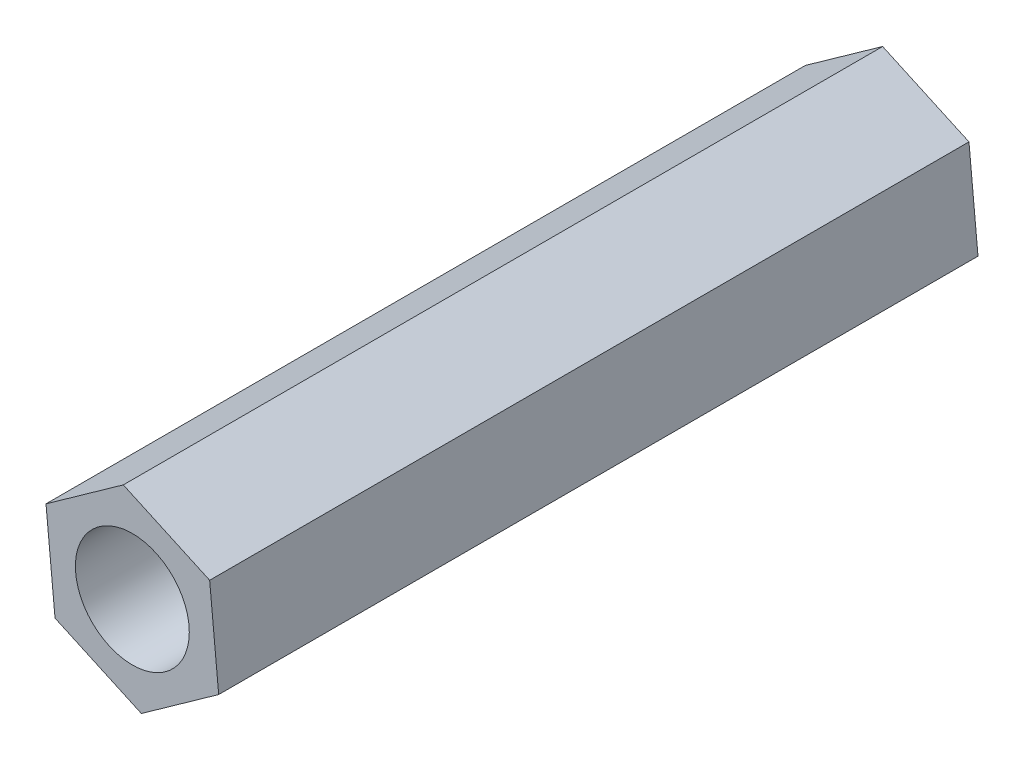
ISO-10303-21;
HEADER;
FILE_DESCRIPTION(('STEP AP214'),'2;1');
FILE_NAME('part.step','',(''),(''),'','','');
FILE_SCHEMA(('AUTOMOTIVE_DESIGN { 1 0 10303 214 1 1 1 1 }'));
ENDSEC;
DATA;
#1=APPLICATION_CONTEXT('core data for automotive mechanical design processes');
#2=APPLICATION_PROTOCOL_DEFINITION('international standard','automotive_design',2000,#1);
#3=PRODUCT_CONTEXT('',#1,'mechanical');
#4=PRODUCT('Part','Part','',(#3));
#5=PRODUCT_RELATED_PRODUCT_CATEGORY('part','',(#4));
#6=PRODUCT_DEFINITION_FORMATION('','',#4);
#7=PRODUCT_DEFINITION_CONTEXT('part definition',#1,'design');
#8=PRODUCT_DEFINITION('design','',#6,#7);
#9=PRODUCT_DEFINITION_SHAPE('','',#8);
#10=(LENGTH_UNIT() NAMED_UNIT(*) SI_UNIT(.MILLI.,.METRE.));
#11=(NAMED_UNIT(*) PLANE_ANGLE_UNIT() SI_UNIT($,.RADIAN.));
#12=(NAMED_UNIT(*) SI_UNIT($,.STERADIAN.) SOLID_ANGLE_UNIT());
#13=UNCERTAINTY_MEASURE_WITH_UNIT(LENGTH_MEASURE(1.E-05),#10,'distance_accuracy_value','');
#14=(GEOMETRIC_REPRESENTATION_CONTEXT(3) GLOBAL_UNCERTAINTY_ASSIGNED_CONTEXT((#13)) GLOBAL_UNIT_ASSIGNED_CONTEXT((#10,
#11,#12)) REPRESENTATION_CONTEXT('',''));
#15=CARTESIAN_POINT('',(0.,0.,0.));
#16=DIRECTION('',(0.,0.,1.));
#17=DIRECTION('',(1.,0.,0.));
#18=AXIS2_PLACEMENT_3D('',#15,#16,#17);
#19=CARTESIAN_POINT('',(0.,0.,20.));
#20=DIRECTION('',(0.,0.,1.));
#21=DIRECTION('',(1.,0.,0.));
#22=AXIS2_PLACEMENT_3D('',#19,#20,#21);
#23=PLANE('',#22);
#24=DIRECTION('',(-0.0950721836324173,0.995470381226566,0.));
#25=VECTOR('',#24,1.);
#26=CARTESIAN_POINT('',(2.27409682668349,-1.03850066098588,20.));
#27=LINE('',#26,#25);
#28=CARTESIAN_POINT('',(2.27409682668349,-1.03850066098588,20.));
#29=VERTEX_POINT('',#28);
#30=CARTESIAN_POINT('',(2.03641636760244,1.45017529208054,20.));
#31=VERTEX_POINT('',#30);
#32=EDGE_CURVE('E146',#29,#31,#27,.T.);
#33=ORIENTED_EDGE('',*,*,#32,.T.);
#34=DIRECTION('',(-0.909638730673394,0.41540026439435,0.));
#35=VECTOR('',#34,1.);
#36=CARTESIAN_POINT('',(2.03641636760244,1.45017529208054,20.));
#37=LINE('',#36,#35);
#38=CARTESIAN_POINT('',(-0.237680459081043,2.48867595306641,20.));
#39=VERTEX_POINT('',#38);
#40=EDGE_CURVE('E94',#31,#39,#37,.T.);
#41=ORIENTED_EDGE('',*,*,#40,.T.);
#42=DIRECTION('',(-0.814566547040977,-0.580070116832216,0.));
#43=VECTOR('',#42,1.);
#44=CARTESIAN_POINT('',(-0.237680459081043,2.48867595306641,20.));
#45=LINE('',#44,#43);
#46=CARTESIAN_POINT('',(-2.27409682668349,1.03850066098588,20.));
#47=VERTEX_POINT('',#46);
#48=EDGE_CURVE('E107',#39,#47,#45,.T.);
#49=ORIENTED_EDGE('',*,*,#48,.T.);
#50=DIRECTION('',(0.0950721836324175,-0.995470381226566,0.));
#51=VECTOR('',#50,1.);
#52=CARTESIAN_POINT('',(-2.27409682668349,1.03850066098588,20.));
#53=LINE('',#52,#51);
#54=CARTESIAN_POINT('',(-2.03641636760244,-1.45017529208054,20.));
#55=VERTEX_POINT('',#54);
#56=EDGE_CURVE('E101',#47,#55,#53,.T.);
#57=ORIENTED_EDGE('',*,*,#56,.T.);
#58=DIRECTION('',(0.909638730673394,-0.41540026439435,0.));
#59=VECTOR('',#58,1.);
#60=CARTESIAN_POINT('',(-2.03641636760244,-1.45017529208054,20.));
#61=LINE('',#60,#59);
#62=CARTESIAN_POINT('',(0.237680459081043,-2.48867595306641,20.));
#63=VERTEX_POINT('',#62);
#64=EDGE_CURVE('E105',#55,#63,#61,.T.);
#65=ORIENTED_EDGE('',*,*,#64,.T.);
#66=DIRECTION('',(0.814566547040977,0.580070116832215,0.));
#67=VECTOR('',#66,1.);
#68=CARTESIAN_POINT('',(0.237680459081043,-2.48867595306641,20.));
#69=LINE('',#68,#67);
#70=EDGE_CURVE('E57',#63,#29,#69,.T.);
#71=ORIENTED_EDGE('',*,*,#70,.T.);
#72=EDGE_LOOP('',(#33,#41,#49,#57,#65,#71));
#73=FACE_BOUND('',#72,.T.);
#74=CARTESIAN_POINT('',(0.,0.,20.));
#75=DIRECTION('',(0.,0.,1.));
#76=DIRECTION('',(1.,0.,0.));
#77=AXIS2_PLACEMENT_3D('',#74,#75,#76);
#78=CIRCLE('',#77,1.5);
#79=CARTESIAN_POINT('',(1.5,0.,20.));
#80=VERTEX_POINT('',#79);
#81=EDGE_CURVE('E134',#80,#80,#78,.T.);
#82=ORIENTED_EDGE('',*,*,#81,.F.);
#83=EDGE_LOOP('',(#82));
#84=FACE_BOUND('',#83,.T.);
#85=ADVANCED_FACE('F39',(#73,#84),#23,.T.);
#86=CARTESIAN_POINT('',(0.,0.,0.));
#87=DIRECTION('',(0.,0.,1.));
#88=DIRECTION('',(1.,0.,0.));
#89=AXIS2_PLACEMENT_3D('',#86,#87,#88);
#90=PLANE('',#89);
#91=DIRECTION('',(-0.0950721836324173,0.995470381226566,0.));
#92=VECTOR('',#91,1.);
#93=CARTESIAN_POINT('',(2.27409682668349,-1.03850066098588,0.));
#94=LINE('',#93,#92);
#95=CARTESIAN_POINT('',(2.27409682668349,-1.03850066098588,0.));
#96=VERTEX_POINT('',#95);
#97=CARTESIAN_POINT('',(2.03641636760244,1.45017529208054,0.));
#98=VERTEX_POINT('',#97);
#99=EDGE_CURVE('E129',#96,#98,#94,.T.);
#100=ORIENTED_EDGE('',*,*,#99,.F.);
#101=DIRECTION('',(0.814566547040977,0.580070116832215,0.));
#102=VECTOR('',#101,1.);
#103=CARTESIAN_POINT('',(0.237680459081043,-2.48867595306641,0.));
#104=LINE('',#103,#102);
#105=CARTESIAN_POINT('',(0.237680459081043,-2.48867595306641,0.));
#106=VERTEX_POINT('',#105);
#107=EDGE_CURVE('E86',#106,#96,#104,.T.);
#108=ORIENTED_EDGE('',*,*,#107,.F.);
#109=DIRECTION('',(0.909638730673394,-0.41540026439435,0.));
#110=VECTOR('',#109,1.);
#111=CARTESIAN_POINT('',(-2.03641636760244,-1.45017529208054,0.));
#112=LINE('',#111,#110);
#113=CARTESIAN_POINT('',(-2.03641636760244,-1.45017529208054,0.));
#114=VERTEX_POINT('',#113);
#115=EDGE_CURVE('E80',#114,#106,#112,.T.);
#116=ORIENTED_EDGE('',*,*,#115,.F.);
#117=DIRECTION('',(0.0950721836324175,-0.995470381226566,0.));
#118=VECTOR('',#117,1.);
#119=CARTESIAN_POINT('',(-2.27409682668349,1.03850066098588,0.));
#120=LINE('',#119,#118);
#121=CARTESIAN_POINT('',(-2.27409682668349,1.03850066098588,0.));
#122=VERTEX_POINT('',#121);
#123=EDGE_CURVE('E116',#122,#114,#120,.T.);
#124=ORIENTED_EDGE('',*,*,#123,.F.);
#125=DIRECTION('',(-0.814566547040977,-0.580070116832216,0.));
#126=VECTOR('',#125,1.);
#127=CARTESIAN_POINT('',(-0.237680459081043,2.48867595306641,0.));
#128=LINE('',#127,#126);
#129=CARTESIAN_POINT('',(-0.237680459081043,2.48867595306641,0.));
#130=VERTEX_POINT('',#129);
#131=EDGE_CURVE('E137',#130,#122,#128,.T.);
#132=ORIENTED_EDGE('',*,*,#131,.F.);
#133=DIRECTION('',(-0.909638730673394,0.41540026439435,0.));
#134=VECTOR('',#133,1.);
#135=CARTESIAN_POINT('',(2.03641636760244,1.45017529208054,0.));
#136=LINE('',#135,#134);
#137=EDGE_CURVE('E133',#98,#130,#136,.T.);
#138=ORIENTED_EDGE('',*,*,#137,.F.);
#139=EDGE_LOOP('',(#100,#108,#116,#124,#132,#138));
#140=FACE_BOUND('',#139,.T.);
#141=CARTESIAN_POINT('',(0.,0.,0.));
#142=DIRECTION('',(0.,0.,1.));
#143=DIRECTION('',(1.,0.,0.));
#144=AXIS2_PLACEMENT_3D('',#141,#142,#143);
#145=CIRCLE('',#144,1.5);
#146=CARTESIAN_POINT('',(1.5,0.,0.));
#147=VERTEX_POINT('',#146);
#148=EDGE_CURVE('E243',#147,#147,#145,.T.);
#149=ORIENTED_EDGE('',*,*,#148,.T.);
#150=EDGE_LOOP('',(#149));
#151=FACE_BOUND('',#150,.T.);
#152=ADVANCED_FACE('F159',(#140,#151),#90,.F.);
#153=CARTESIAN_POINT('',(2.27409682668349,-1.03850066098588,20.));
#154=DIRECTION('',(-0.995470381226566,-0.0950721836324173,0.));
#155=DIRECTION('',(0.0950721836324173,-0.995470381226566,0.));
#156=AXIS2_PLACEMENT_3D('',#153,#154,#155);
#157=PLANE('',#156);
#158=ORIENTED_EDGE('',*,*,#99,.T.);
#159=DIRECTION('',(0.,0.,-1.));
#160=VECTOR('',#159,1.);
#161=CARTESIAN_POINT('',(2.03641636760244,1.45017529208054,20.));
#162=LINE('',#161,#160);
#163=EDGE_CURVE('E11',#31,#98,#162,.T.);
#164=ORIENTED_EDGE('',*,*,#163,.F.);
#165=ORIENTED_EDGE('',*,*,#32,.F.);
#166=DIRECTION('',(0.,0.,-1.));
#167=VECTOR('',#166,1.);
#168=CARTESIAN_POINT('',(2.27409682668349,-1.03850066098588,20.));
#169=LINE('',#168,#167);
#170=EDGE_CURVE('E125',#29,#96,#169,.T.);
#171=ORIENTED_EDGE('',*,*,#170,.T.);
#172=EDGE_LOOP('',(#158,#164,#165,#171));
#173=FACE_BOUND('',#172,.T.);
#174=ADVANCED_FACE('F41',(#173),#157,.F.);
#175=CARTESIAN_POINT('',(2.03641636760244,1.45017529208054,20.));
#176=DIRECTION('',(-0.41540026439435,-0.909638730673394,0.));
#177=DIRECTION('',(0.909638730673394,-0.41540026439435,0.));
#178=AXIS2_PLACEMENT_3D('',#175,#176,#177);
#179=PLANE('',#178);
#180=ORIENTED_EDGE('',*,*,#137,.T.);
#181=DIRECTION('',(0.,0.,-1.));
#182=VECTOR('',#181,1.);
#183=CARTESIAN_POINT('',(-0.237680459081043,2.48867595306641,20.));
#184=LINE('',#183,#182);
#185=EDGE_CURVE('E49',#39,#130,#184,.T.);
#186=ORIENTED_EDGE('',*,*,#185,.F.);
#187=ORIENTED_EDGE('',*,*,#40,.F.);
#188=ORIENTED_EDGE('',*,*,#163,.T.);
#189=EDGE_LOOP('',(#180,#186,#187,#188));
#190=FACE_BOUND('',#189,.T.);
#191=ADVANCED_FACE('F184',(#190),#179,.F.);
#192=CARTESIAN_POINT('',(-0.237680459081043,2.48867595306641,20.));
#193=DIRECTION('',(0.580070116832216,-0.814566547040977,0.));
#194=DIRECTION('',(0.814566547040977,0.580070116832216,0.));
#195=AXIS2_PLACEMENT_3D('',#192,#193,#194);
#196=PLANE('',#195);
#197=ORIENTED_EDGE('',*,*,#131,.T.);
#198=DIRECTION('',(0.,0.,-1.));
#199=VECTOR('',#198,1.);
#200=CARTESIAN_POINT('',(-2.27409682668349,1.03850066098588,20.));
#201=LINE('',#200,#199);
#202=EDGE_CURVE('E118',#47,#122,#201,.T.);
#203=ORIENTED_EDGE('',*,*,#202,.F.);
#204=ORIENTED_EDGE('',*,*,#48,.F.);
#205=ORIENTED_EDGE('',*,*,#185,.T.);
#206=EDGE_LOOP('',(#197,#203,#204,#205));
#207=FACE_BOUND('',#206,.T.);
#208=ADVANCED_FACE('F156',(#207),#196,.F.);
#209=CARTESIAN_POINT('',(-2.27409682668349,1.03850066098588,20.));
#210=DIRECTION('',(0.995470381226566,0.0950721836324175,0.));
#211=DIRECTION('',(-0.0950721836324175,0.995470381226566,0.));
#212=AXIS2_PLACEMENT_3D('',#209,#210,#211);
#213=PLANE('',#212);
#214=ORIENTED_EDGE('',*,*,#123,.T.);
#215=DIRECTION('',(0.,0.,-1.));
#216=VECTOR('',#215,1.);
#217=CARTESIAN_POINT('',(-2.03641636760244,-1.45017529208054,20.));
#218=LINE('',#217,#216);
#219=EDGE_CURVE('E113',#55,#114,#218,.T.);
#220=ORIENTED_EDGE('',*,*,#219,.F.);
#221=ORIENTED_EDGE('',*,*,#56,.F.);
#222=ORIENTED_EDGE('',*,*,#202,.T.);
#223=EDGE_LOOP('',(#214,#220,#221,#222));
#224=FACE_BOUND('',#223,.T.);
#225=ADVANCED_FACE('F114',(#224),#213,.F.);
#226=CARTESIAN_POINT('',(-2.03641636760244,-1.45017529208054,20.));
#227=DIRECTION('',(0.41540026439435,0.909638730673394,0.));
#228=DIRECTION('',(-0.909638730673394,0.41540026439435,0.));
#229=AXIS2_PLACEMENT_3D('',#226,#227,#228);
#230=PLANE('',#229);
#231=ORIENTED_EDGE('',*,*,#115,.T.);
#232=DIRECTION('',(0.,0.,-1.));
#233=VECTOR('',#232,1.);
#234=CARTESIAN_POINT('',(0.237680459081043,-2.48867595306641,20.));
#235=LINE('',#234,#233);
#236=EDGE_CURVE('E119',#63,#106,#235,.T.);
#237=ORIENTED_EDGE('',*,*,#236,.F.);
#238=ORIENTED_EDGE('',*,*,#64,.F.);
#239=ORIENTED_EDGE('',*,*,#219,.T.);
#240=EDGE_LOOP('',(#231,#237,#238,#239));
#241=FACE_BOUND('',#240,.T.);
#242=ADVANCED_FACE('F121',(#241),#230,.F.);
#243=CARTESIAN_POINT('',(0.237680459081043,-2.48867595306641,20.));
#244=DIRECTION('',(-0.580070116832215,0.814566547040977,0.));
#245=DIRECTION('',(-0.814566547040977,-0.580070116832215,0.));
#246=AXIS2_PLACEMENT_3D('',#243,#244,#245);
#247=PLANE('',#246);
#248=ORIENTED_EDGE('',*,*,#107,.T.);
#249=ORIENTED_EDGE('',*,*,#170,.F.);
#250=ORIENTED_EDGE('',*,*,#70,.F.);
#251=ORIENTED_EDGE('',*,*,#236,.T.);
#252=EDGE_LOOP('',(#248,#249,#250,#251));
#253=FACE_BOUND('',#252,.T.);
#254=ADVANCED_FACE('F164',(#253),#247,.F.);
#255=CARTESIAN_POINT('',(0.,0.,20.));
#256=DIRECTION('',(0.,0.,-1.));
#257=DIRECTION('',(-1.,0.,0.));
#258=AXIS2_PLACEMENT_3D('',#255,#256,#257);
#259=CYLINDRICAL_SURFACE('',#258,1.5);
#260=ORIENTED_EDGE('',*,*,#81,.T.);
#261=EDGE_LOOP('',(#260));
#262=FACE_BOUND('',#261,.T.);
#263=ORIENTED_EDGE('',*,*,#148,.F.);
#264=EDGE_LOOP('',(#263));
#265=FACE_BOUND('',#264,.T.);
#266=ADVANCED_FACE('F166',(#262,#265),#259,.F.);
#267=CLOSED_SHELL('',(#85,#152,#174,#191,#208,#225,#242,#254,#266));
#268=MANIFOLD_SOLID_BREP('B2',#267);
#269=ADVANCED_BREP_SHAPE_REPRESENTATION('',(#18,#268),#14);
#270=SHAPE_DEFINITION_REPRESENTATION(#9,#269);
ENDSEC;
END-ISO-10303-21;
